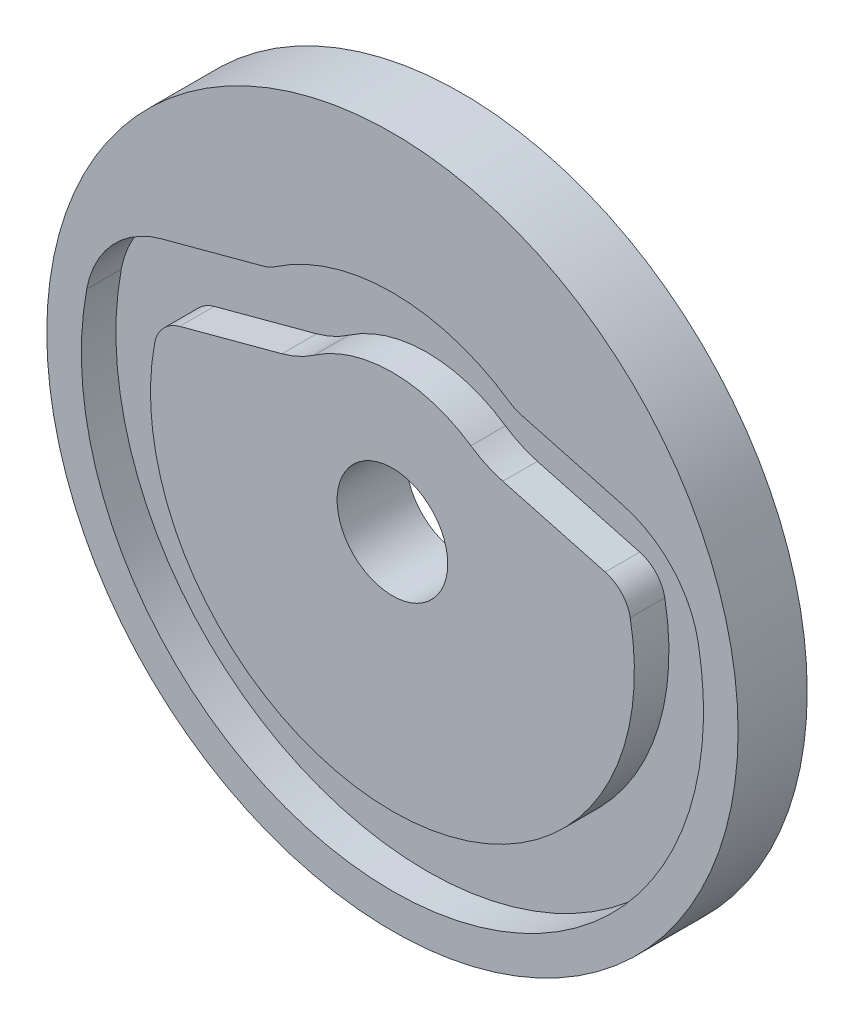
ISO-10303-21;
HEADER;
FILE_DESCRIPTION(('STEP AP214'),'2;1');
FILE_NAME('part.step','',(''),(''),'','','');
FILE_SCHEMA(('AUTOMOTIVE_DESIGN { 1 0 10303 214 1 1 1 1 }'));
ENDSEC;
DATA;
#1=APPLICATION_CONTEXT('core data for automotive mechanical design processes');
#2=APPLICATION_PROTOCOL_DEFINITION('international standard','automotive_design',2000,#1);
#3=PRODUCT_CONTEXT('',#1,'mechanical');
#4=PRODUCT('Part','Part','',(#3));
#5=PRODUCT_RELATED_PRODUCT_CATEGORY('part','',(#4));
#6=PRODUCT_DEFINITION_FORMATION('','',#4);
#7=PRODUCT_DEFINITION_CONTEXT('part definition',#1,'design');
#8=PRODUCT_DEFINITION('design','',#6,#7);
#9=PRODUCT_DEFINITION_SHAPE('','',#8);
#10=(LENGTH_UNIT() NAMED_UNIT(*) SI_UNIT(.MILLI.,.METRE.));
#11=(NAMED_UNIT(*) PLANE_ANGLE_UNIT() SI_UNIT($,.RADIAN.));
#12=(NAMED_UNIT(*) SI_UNIT($,.STERADIAN.) SOLID_ANGLE_UNIT());
#13=UNCERTAINTY_MEASURE_WITH_UNIT(LENGTH_MEASURE(1.E-05),#10,'distance_accuracy_value','');
#14=(GEOMETRIC_REPRESENTATION_CONTEXT(3) GLOBAL_UNCERTAINTY_ASSIGNED_CONTEXT((#13)) GLOBAL_UNIT_ASSIGNED_CONTEXT((#10,
#11,#12)) REPRESENTATION_CONTEXT('',''));
#15=CARTESIAN_POINT('',(0.,0.,0.));
#16=DIRECTION('',(0.,0.,1.));
#17=DIRECTION('',(1.,0.,0.));
#18=AXIS2_PLACEMENT_3D('',#15,#16,#17);
#19=CARTESIAN_POINT('',(0.,0.,10.));
#20=DIRECTION('',(0.,0.,-1.));
#21=DIRECTION('',(-1.,0.,0.));
#22=AXIS2_PLACEMENT_3D('',#19,#20,#21);
#23=CYLINDRICAL_SURFACE('',#22,50.);
#24=CARTESIAN_POINT('',(0.,0.,10.));
#25=DIRECTION('',(0.,0.,1.));
#26=DIRECTION('',(1.,0.,0.));
#27=AXIS2_PLACEMENT_3D('',#24,#25,#26);
#28=CIRCLE('',#27,50.);
#29=CARTESIAN_POINT('',(50.,0.,10.));
#30=VERTEX_POINT('',#29);
#31=EDGE_CURVE('E12',#30,#30,#28,.T.);
#32=ORIENTED_EDGE('',*,*,#31,.F.);
#33=EDGE_LOOP('',(#32));
#34=FACE_BOUND('',#33,.T.);
#35=CARTESIAN_POINT('',(0.,0.,0.));
#36=DIRECTION('',(0.,0.,1.));
#37=DIRECTION('',(1.,0.,0.));
#38=AXIS2_PLACEMENT_3D('',#35,#36,#37);
#39=CIRCLE('',#38,50.);
#40=CARTESIAN_POINT('',(50.,0.,0.));
#41=VERTEX_POINT('',#40);
#42=EDGE_CURVE('E95',#41,#41,#39,.T.);
#43=ORIENTED_EDGE('',*,*,#42,.T.);
#44=EDGE_LOOP('',(#43));
#45=FACE_BOUND('',#44,.T.);
#46=ADVANCED_FACE('F92',(#34,#45),#23,.T.);
#47=CARTESIAN_POINT('',(0.,0.,10.));
#48=DIRECTION('',(0.,0.,1.));
#49=DIRECTION('',(1.,0.,0.));
#50=AXIS2_PLACEMENT_3D('',#47,#48,#49);
#51=PLANE('',#50);
#52=CARTESIAN_POINT('',(-29.4843003247895,5.53859498046357,10.));
#53=DIRECTION('',(0.,0.,1.));
#54=DIRECTION('',(1.,0.,0.));
#55=AXIS2_PLACEMENT_3D('',#52,#53,#54);
#56=CIRCLE('',#55,15.);
#57=CARTESIAN_POINT('',(-33.3665860013274,20.0274823747996,10.));
#58=VERTEX_POINT('',#57);
#59=CARTESIAN_POINT('',(-44.2264504871843,8.30789247069535,10.));
#60=VERTEX_POINT('',#59);
#61=EDGE_CURVE('E107',#58,#60,#56,.T.);
#62=ORIENTED_EDGE('',*,*,#61,.F.);
#63=DIRECTION('',(-0.965925826289067,-0.258819045102525,0.));
#64=VECTOR('',#63,1.);
#65=CARTESIAN_POINT('',(-18.558421380254,23.9953181264034,10.));
#66=LINE('',#65,#64);
#67=CARTESIAN_POINT('',(-18.558421380254,23.9953181264034,10.));
#68=VERTEX_POINT('',#67);
#69=EDGE_CURVE('E312',#68,#58,#66,.T.);
#70=ORIENTED_EDGE('',*,*,#69,.F.);
#71=CARTESIAN_POINT('',(-19.8525166057666,28.8249472578487,10.));
#72=DIRECTION('',(0.,0.,1.));
#73=DIRECTION('',(1.,0.,0.));
#74=AXIS2_PLACEMENT_3D('',#71,#72,#73);
#75=CIRCLE('',#74,5.);
#76=CARTESIAN_POINT('',(-17.0164428049428,24.7070976495846,10.));
#77=VERTEX_POINT('',#76);
#78=EDGE_CURVE('E363',#77,#68,#75,.F.);
#79=ORIENTED_EDGE('',*,*,#78,.F.);
#80=CARTESIAN_POINT('',(0.,0.,10.));
#81=DIRECTION('',(0.,0.,1.));
#82=DIRECTION('',(1.,0.,0.));
#83=AXIS2_PLACEMENT_3D('',#80,#81,#82);
#84=CIRCLE('',#83,30.);
#85=CARTESIAN_POINT('',(17.0164428049428,24.7070976495846,10.));
#86=VERTEX_POINT('',#85);
#87=EDGE_CURVE('E359',#86,#77,#84,.T.);
#88=ORIENTED_EDGE('',*,*,#87,.F.);
#89=CARTESIAN_POINT('',(19.8525166057666,28.8249472578487,10.));
#90=DIRECTION('',(0.,0.,1.));
#91=DIRECTION('',(1.,0.,0.));
#92=AXIS2_PLACEMENT_3D('',#89,#90,#91);
#93=CIRCLE('',#92,5.);
#94=CARTESIAN_POINT('',(18.558421380254,23.9953181264034,10.));
#95=VERTEX_POINT('',#94);
#96=EDGE_CURVE('E355',#95,#86,#93,.F.);
#97=ORIENTED_EDGE('',*,*,#96,.F.);
#98=DIRECTION('',(-0.965925826289067,0.258819045102525,0.));
#99=VECTOR('',#98,1.);
#100=CARTESIAN_POINT('',(18.558421380254,23.9953181264034,10.));
#101=LINE('',#100,#99);
#102=CARTESIAN_POINT('',(33.3665860013274,20.0274823747996,10.));
#103=VERTEX_POINT('',#102);
#104=EDGE_CURVE('E351',#103,#95,#101,.T.);
#105=ORIENTED_EDGE('',*,*,#104,.F.);
#106=CARTESIAN_POINT('',(29.4843003247895,5.53859498046357,10.));
#107=DIRECTION('',(0.,0.,1.));
#108=DIRECTION('',(1.,0.,0.));
#109=AXIS2_PLACEMENT_3D('',#106,#107,#108);
#110=CIRCLE('',#109,15.);
#111=CARTESIAN_POINT('',(44.2264504871843,8.30789247069535,10.));
#112=VERTEX_POINT('',#111);
#113=EDGE_CURVE('E347',#112,#103,#110,.T.);
#114=ORIENTED_EDGE('',*,*,#113,.F.);
#115=CARTESIAN_POINT('',(0.,0.,10.));
#116=DIRECTION('',(0.,0.,1.));
#117=DIRECTION('',(1.,0.,0.));
#118=AXIS2_PLACEMENT_3D('',#115,#116,#117);
#119=CIRCLE('',#118,45.);
#120=EDGE_CURVE('E343',#60,#112,#119,.T.);
#121=ORIENTED_EDGE('',*,*,#120,.F.);
#122=EDGE_LOOP('',(#62,#70,#79,#88,#97,#105,#114,#121));
#123=FACE_BOUND('',#122,.T.);
#124=ORIENTED_EDGE('',*,*,#31,.T.);
#125=EDGE_LOOP('',(#124));
#126=FACE_BOUND('',#125,.T.);
#127=ADVANCED_FACE('F399',(#123,#126),#51,.T.);
#128=CARTESIAN_POINT('',(0.,0.,0.));
#129=DIRECTION('',(0.,0.,1.));
#130=DIRECTION('',(1.,0.,0.));
#131=AXIS2_PLACEMENT_3D('',#128,#129,#130);
#132=PLANE('',#131);
#133=CARTESIAN_POINT('',(0.,0.,0.));
#134=DIRECTION('',(0.,0.,1.));
#135=DIRECTION('',(1.,0.,0.));
#136=AXIS2_PLACEMENT_3D('',#133,#134,#135);
#137=CIRCLE('',#136,8.);
#138=CARTESIAN_POINT('',(8.,0.,0.));
#139=VERTEX_POINT('',#138);
#140=EDGE_CURVE('E268',#139,#139,#137,.T.);
#141=ORIENTED_EDGE('',*,*,#140,.T.);
#142=EDGE_LOOP('',(#141));
#143=FACE_BOUND('',#142,.T.);
#144=ORIENTED_EDGE('',*,*,#42,.F.);
#145=EDGE_LOOP('',(#144));
#146=FACE_BOUND('',#145,.T.);
#147=ADVANCED_FACE('F438',(#143,#146),#132,.F.);
#148=CARTESIAN_POINT('',(-29.4843003247895,5.53859498046357,5.));
#149=DIRECTION('',(0.,0.,1.));
#150=DIRECTION('',(1.,0.,0.));
#151=AXIS2_PLACEMENT_3D('',#148,#149,#150);
#152=CYLINDRICAL_SURFACE('',#151,15.);
#153=ORIENTED_EDGE('',*,*,#61,.T.);
#154=DIRECTION('',(0.,0.,1.));
#155=VECTOR('',#154,1.);
#156=CARTESIAN_POINT('',(-44.2264504871843,8.30789247069535,5.));
#157=LINE('',#156,#155);
#158=CARTESIAN_POINT('',(-44.2264504871843,8.30789247069535,5.));
#159=VERTEX_POINT('',#158);
#160=EDGE_CURVE('E340',#159,#60,#157,.T.);
#161=ORIENTED_EDGE('',*,*,#160,.F.);
#162=CARTESIAN_POINT('',(-29.4843003247895,5.53859498046357,5.));
#163=DIRECTION('',(0.,0.,1.));
#164=DIRECTION('',(1.,0.,0.));
#165=AXIS2_PLACEMENT_3D('',#162,#163,#164);
#166=CIRCLE('',#165,15.);
#167=CARTESIAN_POINT('',(-33.3665860013274,20.0274823747996,5.));
#168=VERTEX_POINT('',#167);
#169=EDGE_CURVE('E307',#168,#159,#166,.T.);
#170=ORIENTED_EDGE('',*,*,#169,.F.);
#171=DIRECTION('',(0.,0.,1.));
#172=VECTOR('',#171,1.);
#173=CARTESIAN_POINT('',(-33.3665860013274,20.0274823747996,5.));
#174=LINE('',#173,#172);
#175=EDGE_CURVE('E370',#168,#58,#174,.T.);
#176=ORIENTED_EDGE('',*,*,#175,.T.);
#177=EDGE_LOOP('',(#153,#161,#170,#176));
#178=FACE_BOUND('',#177,.T.);
#179=ADVANCED_FACE('F409',(#178),#152,.F.);
#180=CARTESIAN_POINT('',(-18.558421380254,23.9953181264034,5.));
#181=DIRECTION('',(-0.258819045102525,0.965925826289067,0.));
#182=DIRECTION('',(-0.965925826289067,-0.258819045102525,0.));
#183=AXIS2_PLACEMENT_3D('',#180,#181,#182);
#184=PLANE('',#183);
#185=ORIENTED_EDGE('',*,*,#69,.T.);
#186=ORIENTED_EDGE('',*,*,#175,.F.);
#187=DIRECTION('',(-0.965925826289067,-0.258819045102525,0.));
#188=VECTOR('',#187,1.);
#189=CARTESIAN_POINT('',(-18.558421380254,23.9953181264034,5.));
#190=LINE('',#189,#188);
#191=CARTESIAN_POINT('',(-18.558421380254,23.9953181264034,5.));
#192=VERTEX_POINT('',#191);
#193=EDGE_CURVE('E336',#192,#168,#190,.T.);
#194=ORIENTED_EDGE('',*,*,#193,.F.);
#195=DIRECTION('',(0.,0.,1.));
#196=VECTOR('',#195,1.);
#197=CARTESIAN_POINT('',(-18.558421380254,23.9953181264034,5.));
#198=LINE('',#197,#196);
#199=EDGE_CURVE('E373',#192,#68,#198,.T.);
#200=ORIENTED_EDGE('',*,*,#199,.T.);
#201=EDGE_LOOP('',(#185,#186,#194,#200));
#202=FACE_BOUND('',#201,.T.);
#203=ADVANCED_FACE('F411',(#202),#184,.F.);
#204=CARTESIAN_POINT('',(-19.8525166057666,28.8249472578487,5.));
#205=DIRECTION('',(0.,0.,1.));
#206=DIRECTION('',(1.,0.,0.));
#207=AXIS2_PLACEMENT_3D('',#204,#205,#206);
#208=CYLINDRICAL_SURFACE('',#207,5.);
#209=ORIENTED_EDGE('',*,*,#78,.T.);
#210=ORIENTED_EDGE('',*,*,#199,.F.);
#211=CARTESIAN_POINT('',(-19.8525166057666,28.8249472578487,5.));
#212=DIRECTION('',(0.,0.,1.));
#213=DIRECTION('',(1.,0.,0.));
#214=AXIS2_PLACEMENT_3D('',#211,#212,#213);
#215=CIRCLE('',#214,5.);
#216=CARTESIAN_POINT('',(-17.0164428049428,24.7070976495846,5.));
#217=VERTEX_POINT('',#216);
#218=EDGE_CURVE('E332',#217,#192,#215,.F.);
#219=ORIENTED_EDGE('',*,*,#218,.F.);
#220=DIRECTION('',(0.,0.,1.));
#221=VECTOR('',#220,1.);
#222=CARTESIAN_POINT('',(-17.0164428049428,24.7070976495846,5.));
#223=LINE('',#222,#221);
#224=EDGE_CURVE('E376',#217,#77,#223,.T.);
#225=ORIENTED_EDGE('',*,*,#224,.T.);
#226=EDGE_LOOP('',(#209,#210,#219,#225));
#227=FACE_BOUND('',#226,.T.);
#228=ADVANCED_FACE('F415',(#227),#208,.T.);
#229=CARTESIAN_POINT('',(0.,0.,5.));
#230=DIRECTION('',(0.,0.,1.));
#231=DIRECTION('',(1.,0.,0.));
#232=AXIS2_PLACEMENT_3D('',#229,#230,#231);
#233=CYLINDRICAL_SURFACE('',#232,30.);
#234=ORIENTED_EDGE('',*,*,#87,.T.);
#235=ORIENTED_EDGE('',*,*,#224,.F.);
#236=CARTESIAN_POINT('',(0.,0.,5.));
#237=DIRECTION('',(0.,0.,1.));
#238=DIRECTION('',(1.,0.,0.));
#239=AXIS2_PLACEMENT_3D('',#236,#237,#238);
#240=CIRCLE('',#239,30.);
#241=CARTESIAN_POINT('',(17.0164428049428,24.7070976495846,5.));
#242=VERTEX_POINT('',#241);
#243=EDGE_CURVE('E328',#242,#217,#240,.T.);
#244=ORIENTED_EDGE('',*,*,#243,.F.);
#245=DIRECTION('',(0.,0.,1.));
#246=VECTOR('',#245,1.);
#247=CARTESIAN_POINT('',(17.0164428049428,24.7070976495846,5.));
#248=LINE('',#247,#246);
#249=EDGE_CURVE('E379',#242,#86,#248,.T.);
#250=ORIENTED_EDGE('',*,*,#249,.T.);
#251=EDGE_LOOP('',(#234,#235,#244,#250));
#252=FACE_BOUND('',#251,.T.);
#253=ADVANCED_FACE('F419',(#252),#233,.F.);
#254=CARTESIAN_POINT('',(19.8525166057666,28.8249472578487,5.));
#255=DIRECTION('',(0.,0.,1.));
#256=DIRECTION('',(1.,0.,0.));
#257=AXIS2_PLACEMENT_3D('',#254,#255,#256);
#258=CYLINDRICAL_SURFACE('',#257,5.);
#259=ORIENTED_EDGE('',*,*,#96,.T.);
#260=ORIENTED_EDGE('',*,*,#249,.F.);
#261=CARTESIAN_POINT('',(19.8525166057666,28.8249472578487,5.));
#262=DIRECTION('',(0.,0.,1.));
#263=DIRECTION('',(1.,0.,0.));
#264=AXIS2_PLACEMENT_3D('',#261,#262,#263);
#265=CIRCLE('',#264,5.);
#266=CARTESIAN_POINT('',(18.558421380254,23.9953181264034,5.));
#267=VERTEX_POINT('',#266);
#268=EDGE_CURVE('E324',#267,#242,#265,.F.);
#269=ORIENTED_EDGE('',*,*,#268,.F.);
#270=DIRECTION('',(0.,0.,1.));
#271=VECTOR('',#270,1.);
#272=CARTESIAN_POINT('',(18.558421380254,23.9953181264034,5.));
#273=LINE('',#272,#271);
#274=EDGE_CURVE('E382',#267,#95,#273,.T.);
#275=ORIENTED_EDGE('',*,*,#274,.T.);
#276=EDGE_LOOP('',(#259,#260,#269,#275));
#277=FACE_BOUND('',#276,.T.);
#278=ADVANCED_FACE('F422',(#277),#258,.T.);
#279=CARTESIAN_POINT('',(18.558421380254,23.9953181264034,5.));
#280=DIRECTION('',(0.258819045102525,0.965925826289067,0.));
#281=DIRECTION('',(-0.965925826289067,0.258819045102525,0.));
#282=AXIS2_PLACEMENT_3D('',#279,#280,#281);
#283=PLANE('',#282);
#284=ORIENTED_EDGE('',*,*,#104,.T.);
#285=ORIENTED_EDGE('',*,*,#274,.F.);
#286=DIRECTION('',(-0.965925826289067,0.258819045102525,0.));
#287=VECTOR('',#286,1.);
#288=CARTESIAN_POINT('',(18.558421380254,23.9953181264034,5.));
#289=LINE('',#288,#287);
#290=CARTESIAN_POINT('',(33.3665860013274,20.0274823747996,5.));
#291=VERTEX_POINT('',#290);
#292=EDGE_CURVE('E320',#291,#267,#289,.T.);
#293=ORIENTED_EDGE('',*,*,#292,.F.);
#294=DIRECTION('',(0.,0.,1.));
#295=VECTOR('',#294,1.);
#296=CARTESIAN_POINT('',(33.3665860013274,20.0274823747996,5.));
#297=LINE('',#296,#295);
#298=EDGE_CURVE('E385',#291,#103,#297,.T.);
#299=ORIENTED_EDGE('',*,*,#298,.T.);
#300=EDGE_LOOP('',(#284,#285,#293,#299));
#301=FACE_BOUND('',#300,.T.);
#302=ADVANCED_FACE('F424',(#301),#283,.F.);
#303=CARTESIAN_POINT('',(29.4843003247895,5.53859498046357,5.));
#304=DIRECTION('',(0.,0.,1.));
#305=DIRECTION('',(1.,0.,0.));
#306=AXIS2_PLACEMENT_3D('',#303,#304,#305);
#307=CYLINDRICAL_SURFACE('',#306,15.);
#308=ORIENTED_EDGE('',*,*,#113,.T.);
#309=ORIENTED_EDGE('',*,*,#298,.F.);
#310=CARTESIAN_POINT('',(29.4843003247895,5.53859498046357,5.));
#311=DIRECTION('',(0.,0.,1.));
#312=DIRECTION('',(1.,0.,0.));
#313=AXIS2_PLACEMENT_3D('',#310,#311,#312);
#314=CIRCLE('',#313,15.);
#315=CARTESIAN_POINT('',(44.2264504871843,8.30789247069535,5.));
#316=VERTEX_POINT('',#315);
#317=EDGE_CURVE('E316',#316,#291,#314,.T.);
#318=ORIENTED_EDGE('',*,*,#317,.F.);
#319=DIRECTION('',(0.,0.,1.));
#320=VECTOR('',#319,1.);
#321=CARTESIAN_POINT('',(44.2264504871843,8.30789247069535,5.));
#322=LINE('',#321,#320);
#323=EDGE_CURVE('E388',#316,#112,#322,.T.);
#324=ORIENTED_EDGE('',*,*,#323,.T.);
#325=EDGE_LOOP('',(#308,#309,#318,#324));
#326=FACE_BOUND('',#325,.T.);
#327=ADVANCED_FACE('F405',(#326),#307,.F.);
#328=CARTESIAN_POINT('',(0.,0.,5.));
#329=DIRECTION('',(0.,0.,1.));
#330=DIRECTION('',(1.,0.,0.));
#331=AXIS2_PLACEMENT_3D('',#328,#329,#330);
#332=CYLINDRICAL_SURFACE('',#331,45.);
#333=ORIENTED_EDGE('',*,*,#120,.T.);
#334=ORIENTED_EDGE('',*,*,#323,.F.);
#335=CARTESIAN_POINT('',(0.,0.,5.));
#336=DIRECTION('',(0.,0.,1.));
#337=DIRECTION('',(1.,0.,0.));
#338=AXIS2_PLACEMENT_3D('',#335,#336,#337);
#339=CIRCLE('',#338,45.);
#340=EDGE_CURVE('E311',#159,#316,#339,.T.);
#341=ORIENTED_EDGE('',*,*,#340,.F.);
#342=ORIENTED_EDGE('',*,*,#160,.T.);
#343=EDGE_LOOP('',(#333,#334,#341,#342));
#344=FACE_BOUND('',#343,.T.);
#345=ADVANCED_FACE('F395',(#344),#332,.F.);
#346=CARTESIAN_POINT('',(-29.4843003247895,5.53859498046357,5.));
#347=DIRECTION('',(0.,0.,1.));
#348=DIRECTION('',(1.,0.,0.));
#349=AXIS2_PLACEMENT_3D('',#346,#347,#348);
#350=PLANE('',#349);
#351=DIRECTION('',(-0.965925826289067,-0.258819045102525,0.));
#352=VECTOR('',#351,1.);
#353=CARTESIAN_POINT('',(-15.9702309292288,14.3360598635127,5.));
#354=LINE('',#353,#352);
#355=CARTESIAN_POINT('',(-15.9702309292288,14.3360598635127,5.));
#356=VERTEX_POINT('',#355);
#357=CARTESIAN_POINT('',(-30.7783955503021,10.3682241119089,5.));
#358=VERTEX_POINT('',#357);
#359=EDGE_CURVE('E218',#356,#358,#354,.T.);
#360=ORIENTED_EDGE('',*,*,#359,.F.);
#361=CARTESIAN_POINT('',(-19.8525166057666,28.8249472578487,5.));
#362=DIRECTION('',(0.,0.,1.));
#363=DIRECTION('',(1.,0.,0.));
#364=AXIS2_PLACEMENT_3D('',#361,#362,#363);
#365=CIRCLE('',#364,15.);
#366=CARTESIAN_POINT('',(-11.3442952032952,16.4713984330564,5.));
#367=VERTEX_POINT('',#366);
#368=EDGE_CURVE('E259',#367,#356,#365,.F.);
#369=ORIENTED_EDGE('',*,*,#368,.F.);
#370=CARTESIAN_POINT('',(0.,0.,5.));
#371=DIRECTION('',(0.,0.,1.));
#372=DIRECTION('',(1.,0.,0.));
#373=AXIS2_PLACEMENT_3D('',#370,#371,#372);
#374=CIRCLE('',#373,20.);
#375=CARTESIAN_POINT('',(11.3442952032952,16.4713984330564,5.));
#376=VERTEX_POINT('',#375);
#377=EDGE_CURVE('E255',#376,#367,#374,.T.);
#378=ORIENTED_EDGE('',*,*,#377,.F.);
#379=CARTESIAN_POINT('',(19.8525166057666,28.8249472578487,5.));
#380=DIRECTION('',(0.,0.,1.));
#381=DIRECTION('',(1.,0.,0.));
#382=AXIS2_PLACEMENT_3D('',#379,#380,#381);
#383=CIRCLE('',#382,15.);
#384=CARTESIAN_POINT('',(15.9702309292288,14.3360598635127,5.));
#385=VERTEX_POINT('',#384);
#386=EDGE_CURVE('E251',#385,#376,#383,.F.);
#387=ORIENTED_EDGE('',*,*,#386,.F.);
#388=DIRECTION('',(-0.965925826289067,0.258819045102525,0.));
#389=VECTOR('',#388,1.);
#390=CARTESIAN_POINT('',(15.9702309292288,14.3360598635127,5.));
#391=LINE('',#390,#389);
#392=CARTESIAN_POINT('',(30.7783955503022,10.3682241119089,5.));
#393=VERTEX_POINT('',#392);
#394=EDGE_CURVE('E247',#393,#385,#391,.T.);
#395=ORIENTED_EDGE('',*,*,#394,.F.);
#396=CARTESIAN_POINT('',(29.4843003247895,5.53859498046357,5.));
#397=DIRECTION('',(0.,0.,1.));
#398=DIRECTION('',(1.,0.,0.));
#399=AXIS2_PLACEMENT_3D('',#396,#397,#398);
#400=CIRCLE('',#399,5.);
#401=CARTESIAN_POINT('',(34.3983503789211,6.46169414387416,5.));
#402=VERTEX_POINT('',#401);
#403=EDGE_CURVE('E229',#402,#393,#400,.T.);
#404=ORIENTED_EDGE('',*,*,#403,.F.);
#405=CARTESIAN_POINT('',(0.,0.,5.));
#406=DIRECTION('',(0.,0.,1.));
#407=DIRECTION('',(1.,0.,0.));
#408=AXIS2_PLACEMENT_3D('',#405,#406,#407);
#409=CIRCLE('',#408,35.);
#410=CARTESIAN_POINT('',(-34.3983503789211,6.46169414387416,5.));
#411=VERTEX_POINT('',#410);
#412=EDGE_CURVE('E209',#411,#402,#409,.T.);
#413=ORIENTED_EDGE('',*,*,#412,.F.);
#414=CARTESIAN_POINT('',(-29.4843003247895,5.53859498046357,5.));
#415=DIRECTION('',(0.,0.,1.));
#416=DIRECTION('',(1.,0.,0.));
#417=AXIS2_PLACEMENT_3D('',#414,#415,#416);
#418=CIRCLE('',#417,5.00000000000001);
#419=EDGE_CURVE('E225',#358,#411,#418,.T.);
#420=ORIENTED_EDGE('',*,*,#419,.F.);
#421=EDGE_LOOP('',(#360,#369,#378,#387,#395,#404,#413,#420));
#422=FACE_BOUND('',#421,.T.);
#423=ORIENTED_EDGE('',*,*,#169,.T.);
#424=ORIENTED_EDGE('',*,*,#340,.T.);
#425=ORIENTED_EDGE('',*,*,#317,.T.);
#426=ORIENTED_EDGE('',*,*,#292,.T.);
#427=ORIENTED_EDGE('',*,*,#268,.T.);
#428=ORIENTED_EDGE('',*,*,#243,.T.);
#429=ORIENTED_EDGE('',*,*,#218,.T.);
#430=ORIENTED_EDGE('',*,*,#193,.T.);
#431=EDGE_LOOP('',(#423,#424,#425,#426,#427,#428,#429,#430));
#432=FACE_BOUND('',#431,.T.);
#433=ADVANCED_FACE('F223',(#422,#432),#350,.T.);
#434=CARTESIAN_POINT('',(-29.4843003247895,5.53859498046357,5.));
#435=DIRECTION('',(0.,0.,1.));
#436=DIRECTION('',(1.,0.,0.));
#437=AXIS2_PLACEMENT_3D('',#434,#435,#436);
#438=CYLINDRICAL_SURFACE('',#437,5.00000000000001);
#439=CARTESIAN_POINT('',(-29.4843003247895,5.53859498046357,10.));
#440=DIRECTION('',(0.,0.,1.));
#441=DIRECTION('',(1.,0.,0.));
#442=AXIS2_PLACEMENT_3D('',#439,#440,#441);
#443=CIRCLE('',#442,5.00000000000001);
#444=CARTESIAN_POINT('',(-30.7783955503021,10.3682241119089,10.));
#445=VERTEX_POINT('',#444);
#446=CARTESIAN_POINT('',(-34.3983503789211,6.46169414387416,10.));
#447=VERTEX_POINT('',#446);
#448=EDGE_CURVE('E265',#445,#447,#443,.T.);
#449=ORIENTED_EDGE('',*,*,#448,.F.);
#450=DIRECTION('',(0.,0.,1.));
#451=VECTOR('',#450,1.);
#452=CARTESIAN_POINT('',(-30.7783955503021,10.3682241119089,5.));
#453=LINE('',#452,#451);
#454=EDGE_CURVE('E233',#358,#445,#453,.T.);
#455=ORIENTED_EDGE('',*,*,#454,.F.);
#456=ORIENTED_EDGE('',*,*,#419,.T.);
#457=DIRECTION('',(0.,0.,1.));
#458=VECTOR('',#457,1.);
#459=CARTESIAN_POINT('',(-34.3983503789211,6.46169414387416,5.));
#460=LINE('',#459,#458);
#461=EDGE_CURVE('E206',#411,#447,#460,.T.);
#462=ORIENTED_EDGE('',*,*,#461,.T.);
#463=EDGE_LOOP('',(#449,#455,#456,#462));
#464=FACE_BOUND('',#463,.T.);
#465=ADVANCED_FACE('F232',(#464),#438,.T.);
#466=CARTESIAN_POINT('',(-15.9702309292288,14.3360598635127,5.));
#467=DIRECTION('',(-0.258819045102525,0.965925826289067,0.));
#468=DIRECTION('',(-0.965925826289067,-0.258819045102525,0.));
#469=AXIS2_PLACEMENT_3D('',#466,#467,#468);
#470=PLANE('',#469);
#471=DIRECTION('',(-0.965925826289067,-0.258819045102525,0.));
#472=VECTOR('',#471,1.);
#473=CARTESIAN_POINT('',(-15.9702309292288,14.3360598635127,10.));
#474=LINE('',#473,#472);
#475=CARTESIAN_POINT('',(-15.9702309292288,14.3360598635127,10.));
#476=VERTEX_POINT('',#475);
#477=EDGE_CURVE('E235',#476,#445,#474,.T.);
#478=ORIENTED_EDGE('',*,*,#477,.F.);
#479=DIRECTION('',(0.,0.,1.));
#480=VECTOR('',#479,1.);
#481=CARTESIAN_POINT('',(-15.9702309292288,14.3360598635127,5.));
#482=LINE('',#481,#480);
#483=EDGE_CURVE('E290',#356,#476,#482,.T.);
#484=ORIENTED_EDGE('',*,*,#483,.F.);
#485=ORIENTED_EDGE('',*,*,#359,.T.);
#486=ORIENTED_EDGE('',*,*,#454,.T.);
#487=EDGE_LOOP('',(#478,#484,#485,#486));
#488=FACE_BOUND('',#487,.T.);
#489=ADVANCED_FACE('F465',(#488),#470,.T.);
#490=CARTESIAN_POINT('',(-19.8525166057666,28.8249472578487,5.));
#491=DIRECTION('',(0.,0.,1.));
#492=DIRECTION('',(1.,0.,0.));
#493=AXIS2_PLACEMENT_3D('',#490,#491,#492);
#494=CYLINDRICAL_SURFACE('',#493,15.);
#495=CARTESIAN_POINT('',(-19.8525166057666,28.8249472578487,10.));
#496=DIRECTION('',(0.,0.,1.));
#497=DIRECTION('',(1.,0.,0.));
#498=AXIS2_PLACEMENT_3D('',#495,#496,#497);
#499=CIRCLE('',#498,15.);
#500=CARTESIAN_POINT('',(-11.3442952032952,16.4713984330564,10.));
#501=VERTEX_POINT('',#500);
#502=EDGE_CURVE('E239',#501,#476,#499,.F.);
#503=ORIENTED_EDGE('',*,*,#502,.F.);
#504=DIRECTION('',(0.,0.,1.));
#505=VECTOR('',#504,1.);
#506=CARTESIAN_POINT('',(-11.3442952032952,16.4713984330564,5.));
#507=LINE('',#506,#505);
#508=EDGE_CURVE('E293',#367,#501,#507,.T.);
#509=ORIENTED_EDGE('',*,*,#508,.F.);
#510=ORIENTED_EDGE('',*,*,#368,.T.);
#511=ORIENTED_EDGE('',*,*,#483,.T.);
#512=EDGE_LOOP('',(#503,#509,#510,#511));
#513=FACE_BOUND('',#512,.T.);
#514=ADVANCED_FACE('F517',(#513),#494,.F.);
#515=CARTESIAN_POINT('',(0.,0.,5.));
#516=DIRECTION('',(0.,0.,1.));
#517=DIRECTION('',(1.,0.,0.));
#518=AXIS2_PLACEMENT_3D('',#515,#516,#517);
#519=CYLINDRICAL_SURFACE('',#518,20.);
#520=CARTESIAN_POINT('',(0.,0.,10.));
#521=DIRECTION('',(0.,0.,1.));
#522=DIRECTION('',(1.,0.,0.));
#523=AXIS2_PLACEMENT_3D('',#520,#521,#522);
#524=CIRCLE('',#523,20.);
#525=CARTESIAN_POINT('',(11.3442952032952,16.4713984330564,10.));
#526=VERTEX_POINT('',#525);
#527=EDGE_CURVE('E281',#526,#501,#524,.T.);
#528=ORIENTED_EDGE('',*,*,#527,.F.);
#529=DIRECTION('',(0.,0.,1.));
#530=VECTOR('',#529,1.);
#531=CARTESIAN_POINT('',(11.3442952032952,16.4713984330564,5.));
#532=LINE('',#531,#530);
#533=EDGE_CURVE('E296',#376,#526,#532,.T.);
#534=ORIENTED_EDGE('',*,*,#533,.F.);
#535=ORIENTED_EDGE('',*,*,#377,.T.);
#536=ORIENTED_EDGE('',*,*,#508,.T.);
#537=EDGE_LOOP('',(#528,#534,#535,#536));
#538=FACE_BOUND('',#537,.T.);
#539=ADVANCED_FACE('F527',(#538),#519,.T.);
#540=CARTESIAN_POINT('',(19.8525166057666,28.8249472578487,5.));
#541=DIRECTION('',(0.,0.,1.));
#542=DIRECTION('',(1.,0.,0.));
#543=AXIS2_PLACEMENT_3D('',#540,#541,#542);
#544=CYLINDRICAL_SURFACE('',#543,15.);
#545=CARTESIAN_POINT('',(19.8525166057666,28.8249472578487,10.));
#546=DIRECTION('',(0.,0.,1.));
#547=DIRECTION('',(1.,0.,0.));
#548=AXIS2_PLACEMENT_3D('',#545,#546,#547);
#549=CIRCLE('',#548,15.);
#550=CARTESIAN_POINT('',(15.9702309292288,14.3360598635127,10.));
#551=VERTEX_POINT('',#550);
#552=EDGE_CURVE('E277',#551,#526,#549,.F.);
#553=ORIENTED_EDGE('',*,*,#552,.F.);
#554=DIRECTION('',(0.,0.,1.));
#555=VECTOR('',#554,1.);
#556=CARTESIAN_POINT('',(15.9702309292288,14.3360598635127,5.));
#557=LINE('',#556,#555);
#558=EDGE_CURVE('E299',#385,#551,#557,.T.);
#559=ORIENTED_EDGE('',*,*,#558,.F.);
#560=ORIENTED_EDGE('',*,*,#386,.T.);
#561=ORIENTED_EDGE('',*,*,#533,.T.);
#562=EDGE_LOOP('',(#553,#559,#560,#561));
#563=FACE_BOUND('',#562,.T.);
#564=ADVANCED_FACE('F537',(#563),#544,.F.);
#565=CARTESIAN_POINT('',(15.9702309292288,14.3360598635127,5.));
#566=DIRECTION('',(0.258819045102525,0.965925826289067,0.));
#567=DIRECTION('',(-0.965925826289067,0.258819045102525,0.));
#568=AXIS2_PLACEMENT_3D('',#565,#566,#567);
#569=PLANE('',#568);
#570=DIRECTION('',(-0.965925826289067,0.258819045102525,0.));
#571=VECTOR('',#570,1.);
#572=CARTESIAN_POINT('',(15.9702309292288,14.3360598635127,10.));
#573=LINE('',#572,#571);
#574=CARTESIAN_POINT('',(30.7783955503022,10.3682241119089,10.));
#575=VERTEX_POINT('',#574);
#576=EDGE_CURVE('E273',#575,#551,#573,.T.);
#577=ORIENTED_EDGE('',*,*,#576,.F.);
#578=DIRECTION('',(0.,0.,1.));
#579=VECTOR('',#578,1.);
#580=CARTESIAN_POINT('',(30.7783955503022,10.3682241119089,5.));
#581=LINE('',#580,#579);
#582=EDGE_CURVE('E302',#393,#575,#581,.T.);
#583=ORIENTED_EDGE('',*,*,#582,.F.);
#584=ORIENTED_EDGE('',*,*,#394,.T.);
#585=ORIENTED_EDGE('',*,*,#558,.T.);
#586=EDGE_LOOP('',(#577,#583,#584,#585));
#587=FACE_BOUND('',#586,.T.);
#588=ADVANCED_FACE('F547',(#587),#569,.T.);
#589=CARTESIAN_POINT('',(29.4843003247895,5.53859498046357,5.));
#590=DIRECTION('',(0.,0.,1.));
#591=DIRECTION('',(1.,0.,0.));
#592=AXIS2_PLACEMENT_3D('',#589,#590,#591);
#593=CYLINDRICAL_SURFACE('',#592,5.);
#594=CARTESIAN_POINT('',(29.4843003247895,5.53859498046357,10.));
#595=DIRECTION('',(0.,0.,1.));
#596=DIRECTION('',(1.,0.,0.));
#597=AXIS2_PLACEMENT_3D('',#594,#595,#596);
#598=CIRCLE('',#597,5.);
#599=CARTESIAN_POINT('',(34.3983503789211,6.46169414387416,10.));
#600=VERTEX_POINT('',#599);
#601=EDGE_CURVE('E115',#600,#575,#598,.T.);
#602=ORIENTED_EDGE('',*,*,#601,.F.);
#603=DIRECTION('',(0.,0.,1.));
#604=VECTOR('',#603,1.);
#605=CARTESIAN_POINT('',(34.3983503789211,6.46169414387416,5.));
#606=LINE('',#605,#604);
#607=EDGE_CURVE('E217',#402,#600,#606,.T.);
#608=ORIENTED_EDGE('',*,*,#607,.F.);
#609=ORIENTED_EDGE('',*,*,#403,.T.);
#610=ORIENTED_EDGE('',*,*,#582,.T.);
#611=EDGE_LOOP('',(#602,#608,#609,#610));
#612=FACE_BOUND('',#611,.T.);
#613=ADVANCED_FACE('F557',(#612),#593,.T.);
#614=CARTESIAN_POINT('',(0.,0.,5.));
#615=DIRECTION('',(0.,0.,1.));
#616=DIRECTION('',(1.,0.,0.));
#617=AXIS2_PLACEMENT_3D('',#614,#615,#616);
#618=CYLINDRICAL_SURFACE('',#617,35.);
#619=CARTESIAN_POINT('',(0.,0.,10.));
#620=DIRECTION('',(0.,0.,1.));
#621=DIRECTION('',(1.,0.,0.));
#622=AXIS2_PLACEMENT_3D('',#619,#620,#621);
#623=CIRCLE('',#622,35.);
#624=EDGE_CURVE('E211',#447,#600,#623,.T.);
#625=ORIENTED_EDGE('',*,*,#624,.F.);
#626=ORIENTED_EDGE('',*,*,#461,.F.);
#627=ORIENTED_EDGE('',*,*,#412,.T.);
#628=ORIENTED_EDGE('',*,*,#607,.T.);
#629=EDGE_LOOP('',(#625,#626,#627,#628));
#630=FACE_BOUND('',#629,.T.);
#631=ADVANCED_FACE('F208',(#630),#618,.T.);
#632=CARTESIAN_POINT('',(0.,0.,10.));
#633=DIRECTION('',(0.,0.,1.));
#634=DIRECTION('',(1.,0.,0.));
#635=AXIS2_PLACEMENT_3D('',#632,#633,#634);
#636=CIRCLE('',#635,8.);
#637=CARTESIAN_POINT('',(8.,0.,10.));
#638=VERTEX_POINT('',#637);
#639=EDGE_CURVE('E242',#638,#638,#636,.T.);
#640=ORIENTED_EDGE('',*,*,#639,.F.);
#641=EDGE_LOOP('',(#640));
#642=FACE_BOUND('',#641,.T.);
#643=ORIENTED_EDGE('',*,*,#477,.T.);
#644=ORIENTED_EDGE('',*,*,#448,.T.);
#645=ORIENTED_EDGE('',*,*,#624,.T.);
#646=ORIENTED_EDGE('',*,*,#601,.T.);
#647=ORIENTED_EDGE('',*,*,#576,.T.);
#648=ORIENTED_EDGE('',*,*,#552,.T.);
#649=ORIENTED_EDGE('',*,*,#527,.T.);
#650=ORIENTED_EDGE('',*,*,#502,.T.);
#651=EDGE_LOOP('',(#643,#644,#645,#646,#647,#648,#649,#650));
#652=FACE_BOUND('',#651,.T.);
#653=ADVANCED_FACE('F440',(#642,#652),#51,.T.);
#654=CARTESIAN_POINT('',(0.,0.,0.));
#655=DIRECTION('',(0.,0.,1.));
#656=DIRECTION('',(1.,0.,0.));
#657=AXIS2_PLACEMENT_3D('',#654,#655,#656);
#658=CYLINDRICAL_SURFACE('',#657,8.);
#659=ORIENTED_EDGE('',*,*,#140,.F.);
#660=EDGE_LOOP('',(#659));
#661=FACE_BOUND('',#660,.T.);
#662=ORIENTED_EDGE('',*,*,#639,.T.);
#663=EDGE_LOOP('',(#662));
#664=FACE_BOUND('',#663,.T.);
#665=ADVANCED_FACE('F577',(#661,#664),#658,.F.);
#666=CLOSED_SHELL('',(#46,#127,#147,#179,#203,#228,#253,#278,#302,#327,#345,#433,#465,#489,#514,
#539,#564,#588,#613,#631,#653,#665));
#667=MANIFOLD_SOLID_BREP('B2',#666);
#668=ADVANCED_BREP_SHAPE_REPRESENTATION('',(#18,#667),#14);
#669=SHAPE_DEFINITION_REPRESENTATION(#9,#668);
ENDSEC;
END-ISO-10303-21;
